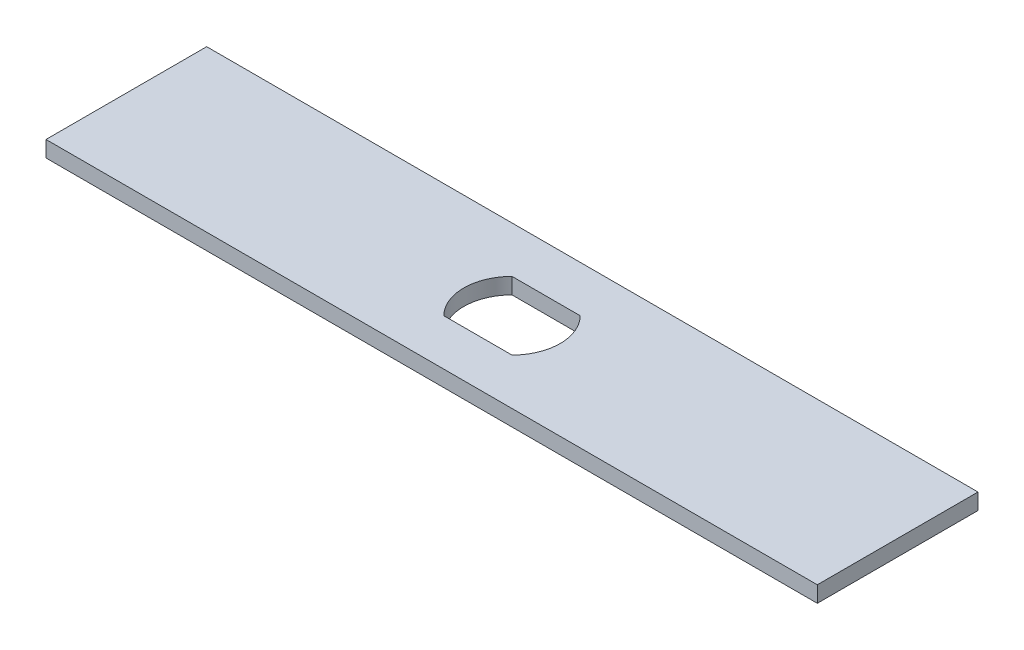
ISO-10303-21;
HEADER;
FILE_DESCRIPTION(('STEP AP214'),'2;1');
FILE_NAME('part.step','',(''),(''),'','','');
FILE_SCHEMA(('AUTOMOTIVE_DESIGN { 1 0 10303 214 1 1 1 1 }'));
ENDSEC;
DATA;
#1=APPLICATION_CONTEXT('core data for automotive mechanical design processes');
#2=APPLICATION_PROTOCOL_DEFINITION('international standard','automotive_design',2000,#1);
#3=PRODUCT_CONTEXT('',#1,'mechanical');
#4=PRODUCT('Part','Part','',(#3));
#5=PRODUCT_RELATED_PRODUCT_CATEGORY('part','',(#4));
#6=PRODUCT_DEFINITION_FORMATION('','',#4);
#7=PRODUCT_DEFINITION_CONTEXT('part definition',#1,'design');
#8=PRODUCT_DEFINITION('design','',#6,#7);
#9=PRODUCT_DEFINITION_SHAPE('','',#8);
#10=(LENGTH_UNIT() NAMED_UNIT(*) SI_UNIT(.MILLI.,.METRE.));
#11=(NAMED_UNIT(*) PLANE_ANGLE_UNIT() SI_UNIT($,.RADIAN.));
#12=(NAMED_UNIT(*) SI_UNIT($,.STERADIAN.) SOLID_ANGLE_UNIT());
#13=UNCERTAINTY_MEASURE_WITH_UNIT(LENGTH_MEASURE(1.E-05),#10,'distance_accuracy_value','');
#14=(GEOMETRIC_REPRESENTATION_CONTEXT(3) GLOBAL_UNCERTAINTY_ASSIGNED_CONTEXT((#13)) GLOBAL_UNIT_ASSIGNED_CONTEXT((#10,
#11,#12)) REPRESENTATION_CONTEXT('',''));
#15=CARTESIAN_POINT('',(0.,0.,0.));
#16=DIRECTION('',(0.,0.,1.));
#17=DIRECTION('',(1.,0.,0.));
#18=AXIS2_PLACEMENT_3D('',#15,#16,#17);
#19=CARTESIAN_POINT('',(0.,6.35,0.));
#20=DIRECTION('',(0.,0.,-1.));
#21=DIRECTION('',(-1.,0.,0.));
#22=AXIS2_PLACEMENT_3D('',#19,#20,#21);
#23=PLANE('',#22);
#24=DIRECTION('',(1.,0.,0.));
#25=VECTOR('',#24,1.);
#26=CARTESIAN_POINT('',(0.,0.,0.));
#27=LINE('',#26,#25);
#28=CARTESIAN_POINT('',(0.,0.,0.));
#29=VERTEX_POINT('',#28);
#30=CARTESIAN_POINT('',(304.8,0.,0.));
#31=VERTEX_POINT('',#30);
#32=EDGE_CURVE('E159',#29,#31,#27,.T.);
#33=ORIENTED_EDGE('',*,*,#32,.T.);
#34=DIRECTION('',(0.,-1.,0.));
#35=VECTOR('',#34,1.);
#36=CARTESIAN_POINT('',(304.8,6.35,0.));
#37=LINE('',#36,#35);
#38=CARTESIAN_POINT('',(304.8,6.35,0.));
#39=VERTEX_POINT('',#38);
#40=EDGE_CURVE('E11',#39,#31,#37,.T.);
#41=ORIENTED_EDGE('',*,*,#40,.F.);
#42=DIRECTION('',(1.,0.,0.));
#43=VECTOR('',#42,1.);
#44=CARTESIAN_POINT('',(0.,6.35,0.));
#45=LINE('',#44,#43);
#46=CARTESIAN_POINT('',(0.,6.35,0.));
#47=VERTEX_POINT('',#46);
#48=EDGE_CURVE('E125',#47,#39,#45,.T.);
#49=ORIENTED_EDGE('',*,*,#48,.F.);
#50=DIRECTION('',(0.,-1.,0.));
#51=VECTOR('',#50,1.);
#52=CARTESIAN_POINT('',(0.,6.35,0.));
#53=LINE('',#52,#51);
#54=EDGE_CURVE('E65',#47,#29,#53,.T.);
#55=ORIENTED_EDGE('',*,*,#54,.T.);
#56=EDGE_LOOP('',(#33,#41,#49,#55));
#57=FACE_BOUND('',#56,.T.);
#58=ADVANCED_FACE('F45',(#57),#23,.F.);
#59=CARTESIAN_POINT('',(304.8,6.35,0.));
#60=DIRECTION('',(-1.,0.,0.));
#61=DIRECTION('',(0.,0.,1.));
#62=AXIS2_PLACEMENT_3D('',#59,#60,#61);
#63=PLANE('',#62);
#64=DIRECTION('',(0.,0.,-1.));
#65=VECTOR('',#64,1.);
#66=CARTESIAN_POINT('',(304.8,0.,0.));
#67=LINE('',#66,#65);
#68=CARTESIAN_POINT('',(304.8,0.,-63.5));
#69=VERTEX_POINT('',#68);
#70=EDGE_CURVE('E132',#31,#69,#67,.T.);
#71=ORIENTED_EDGE('',*,*,#70,.T.);
#72=DIRECTION('',(0.,-1.,0.));
#73=VECTOR('',#72,1.);
#74=CARTESIAN_POINT('',(304.8,6.35,-63.5));
#75=LINE('',#74,#73);
#76=CARTESIAN_POINT('',(304.8,6.35,-63.5));
#77=VERTEX_POINT('',#76);
#78=EDGE_CURVE('E56',#77,#69,#75,.T.);
#79=ORIENTED_EDGE('',*,*,#78,.F.);
#80=DIRECTION('',(0.,0.,-1.));
#81=VECTOR('',#80,1.);
#82=CARTESIAN_POINT('',(304.8,6.35,0.));
#83=LINE('',#82,#81);
#84=EDGE_CURVE('E119',#39,#77,#83,.T.);
#85=ORIENTED_EDGE('',*,*,#84,.F.);
#86=ORIENTED_EDGE('',*,*,#40,.T.);
#87=EDGE_LOOP('',(#71,#79,#85,#86));
#88=FACE_BOUND('',#87,.T.);
#89=ADVANCED_FACE('F131',(#88),#63,.F.);
#90=CARTESIAN_POINT('',(0.,6.35,-63.5));
#91=DIRECTION('',(0.,0.,-1.));
#92=DIRECTION('',(-1.,0.,0.));
#93=AXIS2_PLACEMENT_3D('',#90,#91,#92);
#94=PLANE('',#93);
#95=DIRECTION('',(1.,0.,0.));
#96=VECTOR('',#95,1.);
#97=CARTESIAN_POINT('',(0.,0.,-63.5));
#98=LINE('',#97,#96);
#99=CARTESIAN_POINT('',(0.,0.,-63.5));
#100=VERTEX_POINT('',#99);
#101=EDGE_CURVE('E164',#100,#69,#98,.T.);
#102=ORIENTED_EDGE('',*,*,#101,.F.);
#103=DIRECTION('',(0.,-1.,0.));
#104=VECTOR('',#103,1.);
#105=CARTESIAN_POINT('',(0.,6.35,-63.5));
#106=LINE('',#105,#104);
#107=CARTESIAN_POINT('',(0.,6.35,-63.5));
#108=VERTEX_POINT('',#107);
#109=EDGE_CURVE('E91',#108,#100,#106,.T.);
#110=ORIENTED_EDGE('',*,*,#109,.F.);
#111=DIRECTION('',(1.,0.,0.));
#112=VECTOR('',#111,1.);
#113=CARTESIAN_POINT('',(0.,6.35,-63.5));
#114=LINE('',#113,#112);
#115=EDGE_CURVE('E124',#108,#77,#114,.T.);
#116=ORIENTED_EDGE('',*,*,#115,.T.);
#117=ORIENTED_EDGE('',*,*,#78,.T.);
#118=EDGE_LOOP('',(#102,#110,#116,#117));
#119=FACE_BOUND('',#118,.T.);
#120=ADVANCED_FACE('F137',(#119),#94,.T.);
#121=CARTESIAN_POINT('',(152.4,6.35,-31.75));
#122=DIRECTION('',(0.,-1.,0.));
#123=DIRECTION('',(0.,0.,-1.));
#124=AXIS2_PLACEMENT_3D('',#121,#122,#123);
#125=CYLINDRICAL_SURFACE('',#124,19.05);
#126=CARTESIAN_POINT('',(152.4,0.,-31.75));
#127=DIRECTION('',(0.,1.,0.));
#128=DIRECTION('',(0.,0.,1.));
#129=AXIS2_PLACEMENT_3D('',#126,#127,#128);
#130=CIRCLE('',#129,19.05);
#131=CARTESIAN_POINT('',(165.870384181604,0.,-18.2796158183964));
#132=VERTEX_POINT('',#131);
#133=CARTESIAN_POINT('',(165.870384181604,0.,-45.2203841816036));
#134=VERTEX_POINT('',#133);
#135=EDGE_CURVE('E146',#132,#134,#130,.T.);
#136=ORIENTED_EDGE('',*,*,#135,.F.);
#137=DIRECTION('',(0.,-1.,0.));
#138=VECTOR('',#137,1.);
#139=CARTESIAN_POINT('',(165.870384181604,6.35,-18.2796158183964));
#140=LINE('',#139,#138);
#141=CARTESIAN_POINT('',(165.870384181604,6.35,-18.2796158183964));
#142=VERTEX_POINT('',#141);
#143=EDGE_CURVE('E49',#142,#132,#140,.T.);
#144=ORIENTED_EDGE('',*,*,#143,.F.);
#145=CARTESIAN_POINT('',(152.4,6.35,-31.75));
#146=DIRECTION('',(0.,1.,0.));
#147=DIRECTION('',(0.,0.,1.));
#148=AXIS2_PLACEMENT_3D('',#145,#146,#147);
#149=CIRCLE('',#148,19.05);
#150=CARTESIAN_POINT('',(165.870384181604,6.35,-45.2203841816036));
#151=VERTEX_POINT('',#150);
#152=EDGE_CURVE('E171',#142,#151,#149,.T.);
#153=ORIENTED_EDGE('',*,*,#152,.T.);
#154=DIRECTION('',(0.,-1.,0.));
#155=VECTOR('',#154,1.);
#156=CARTESIAN_POINT('',(165.870384181604,6.35,-45.2203841816036));
#157=LINE('',#156,#155);
#158=EDGE_CURVE('E142',#151,#134,#157,.T.);
#159=ORIENTED_EDGE('',*,*,#158,.T.);
#160=EDGE_LOOP('',(#136,#144,#153,#159));
#161=FACE_BOUND('',#160,.T.);
#162=ADVANCED_FACE('F196',(#161),#125,.F.);
#163=CARTESIAN_POINT('',(0.,6.35,-18.2796158183964));
#164=DIRECTION('',(0.,0.,1.));
#165=DIRECTION('',(1.,0.,0.));
#166=AXIS2_PLACEMENT_3D('',#163,#164,#165);
#167=PLANE('',#166);
#168=DIRECTION('',(-1.,0.,0.));
#169=VECTOR('',#168,1.);
#170=CARTESIAN_POINT('',(0.,0.,-18.2796158183964));
#171=LINE('',#170,#169);
#172=CARTESIAN_POINT('',(138.929615818396,0.,-18.2796158183964));
#173=VERTEX_POINT('',#172);
#174=EDGE_CURVE('E150',#132,#173,#171,.T.);
#175=ORIENTED_EDGE('',*,*,#174,.T.);
#176=DIRECTION('',(0.,-1.,0.));
#177=VECTOR('',#176,1.);
#178=CARTESIAN_POINT('',(138.929615818396,6.35,-18.2796158183964));
#179=LINE('',#178,#177);
#180=CARTESIAN_POINT('',(138.929615818396,6.35,-18.2796158183964));
#181=VERTEX_POINT('',#180);
#182=EDGE_CURVE('E180',#181,#173,#179,.T.);
#183=ORIENTED_EDGE('',*,*,#182,.F.);
#184=DIRECTION('',(-1.,0.,0.));
#185=VECTOR('',#184,1.);
#186=CARTESIAN_POINT('',(0.,6.35,-18.2796158183964));
#187=LINE('',#186,#185);
#188=EDGE_CURVE('E190',#142,#181,#187,.T.);
#189=ORIENTED_EDGE('',*,*,#188,.F.);
#190=ORIENTED_EDGE('',*,*,#143,.T.);
#191=EDGE_LOOP('',(#175,#183,#189,#190));
#192=FACE_BOUND('',#191,.T.);
#193=ADVANCED_FACE('F47',(#192),#167,.F.);
#194=CARTESIAN_POINT('',(138.929615818396,0.,-45.2203841816036));
#195=VERTEX_POINT('',#194);
#196=EDGE_CURVE('E151',#195,#173,#130,.T.);
#197=ORIENTED_EDGE('',*,*,#196,.F.);
#198=DIRECTION('',(0.,-1.,0.));
#199=VECTOR('',#198,1.);
#200=CARTESIAN_POINT('',(138.929615818396,6.35,-45.2203841816036));
#201=LINE('',#200,#199);
#202=CARTESIAN_POINT('',(138.929615818396,6.35,-45.2203841816036));
#203=VERTEX_POINT('',#202);
#204=EDGE_CURVE('E178',#203,#195,#201,.T.);
#205=ORIENTED_EDGE('',*,*,#204,.F.);
#206=EDGE_CURVE('E208',#203,#181,#149,.T.);
#207=ORIENTED_EDGE('',*,*,#206,.T.);
#208=ORIENTED_EDGE('',*,*,#182,.T.);
#209=EDGE_LOOP('',(#197,#205,#207,#208));
#210=FACE_BOUND('',#209,.T.);
#211=ADVANCED_FACE('F203',(#210),#125,.F.);
#212=CARTESIAN_POINT('',(0.,6.35,-45.2203841816036));
#213=DIRECTION('',(0.,0.,1.));
#214=DIRECTION('',(1.,0.,0.));
#215=AXIS2_PLACEMENT_3D('',#212,#213,#214);
#216=PLANE('',#215);
#217=DIRECTION('',(-1.,0.,0.));
#218=VECTOR('',#217,1.);
#219=CARTESIAN_POINT('',(0.,0.,-45.2203841816036));
#220=LINE('',#219,#218);
#221=EDGE_CURVE('E155',#134,#195,#220,.T.);
#222=ORIENTED_EDGE('',*,*,#221,.F.);
#223=ORIENTED_EDGE('',*,*,#158,.F.);
#224=DIRECTION('',(-1.,0.,0.));
#225=VECTOR('',#224,1.);
#226=CARTESIAN_POINT('',(0.,6.35,-45.2203841816036));
#227=LINE('',#226,#225);
#228=EDGE_CURVE('E201',#151,#203,#227,.T.);
#229=ORIENTED_EDGE('',*,*,#228,.T.);
#230=ORIENTED_EDGE('',*,*,#204,.T.);
#231=EDGE_LOOP('',(#222,#223,#229,#230));
#232=FACE_BOUND('',#231,.T.);
#233=ADVANCED_FACE('F200',(#232),#216,.T.);
#234=CARTESIAN_POINT('',(0.,6.35,0.));
#235=DIRECTION('',(-1.,0.,0.));
#236=DIRECTION('',(0.,0.,1.));
#237=AXIS2_PLACEMENT_3D('',#234,#235,#236);
#238=PLANE('',#237);
#239=DIRECTION('',(0.,0.,-1.));
#240=VECTOR('',#239,1.);
#241=CARTESIAN_POINT('',(0.,0.,0.));
#242=LINE('',#241,#240);
#243=EDGE_CURVE('E167',#29,#100,#242,.T.);
#244=ORIENTED_EDGE('',*,*,#243,.F.);
#245=ORIENTED_EDGE('',*,*,#54,.F.);
#246=DIRECTION('',(0.,0.,-1.));
#247=VECTOR('',#246,1.);
#248=CARTESIAN_POINT('',(0.,6.35,0.));
#249=LINE('',#248,#247);
#250=EDGE_CURVE('E139',#47,#108,#249,.T.);
#251=ORIENTED_EDGE('',*,*,#250,.T.);
#252=ORIENTED_EDGE('',*,*,#109,.T.);
#253=EDGE_LOOP('',(#244,#245,#251,#252));
#254=FACE_BOUND('',#253,.T.);
#255=ADVANCED_FACE('F216',(#254),#238,.T.);
#256=CARTESIAN_POINT('',(0.,6.35,0.));
#257=DIRECTION('',(0.,1.,0.));
#258=DIRECTION('',(0.,0.,1.));
#259=AXIS2_PLACEMENT_3D('',#256,#257,#258);
#260=PLANE('',#259);
#261=ORIENTED_EDGE('',*,*,#152,.F.);
#262=ORIENTED_EDGE('',*,*,#188,.T.);
#263=ORIENTED_EDGE('',*,*,#206,.F.);
#264=ORIENTED_EDGE('',*,*,#228,.F.);
#265=EDGE_LOOP('',(#261,#262,#263,#264));
#266=FACE_BOUND('',#265,.T.);
#267=ORIENTED_EDGE('',*,*,#48,.T.);
#268=ORIENTED_EDGE('',*,*,#84,.T.);
#269=ORIENTED_EDGE('',*,*,#115,.F.);
#270=ORIENTED_EDGE('',*,*,#250,.F.);
#271=EDGE_LOOP('',(#267,#268,#269,#270));
#272=FACE_BOUND('',#271,.T.);
#273=ADVANCED_FACE('F121',(#266,#272),#260,.T.);
#274=CARTESIAN_POINT('',(0.,0.,0.));
#275=DIRECTION('',(0.,1.,0.));
#276=DIRECTION('',(0.,0.,1.));
#277=AXIS2_PLACEMENT_3D('',#274,#275,#276);
#278=PLANE('',#277);
#279=ORIENTED_EDGE('',*,*,#135,.T.);
#280=ORIENTED_EDGE('',*,*,#221,.T.);
#281=ORIENTED_EDGE('',*,*,#196,.T.);
#282=ORIENTED_EDGE('',*,*,#174,.F.);
#283=EDGE_LOOP('',(#279,#280,#281,#282));
#284=FACE_BOUND('',#283,.T.);
#285=ORIENTED_EDGE('',*,*,#32,.F.);
#286=ORIENTED_EDGE('',*,*,#243,.T.);
#287=ORIENTED_EDGE('',*,*,#101,.T.);
#288=ORIENTED_EDGE('',*,*,#70,.F.);
#289=EDGE_LOOP('',(#285,#286,#287,#288));
#290=FACE_BOUND('',#289,.T.);
#291=ADVANCED_FACE('F193',(#284,#290),#278,.F.);
#292=CLOSED_SHELL('',(#58,#89,#120,#162,#193,#211,#233,#255,#273,#291));
#293=MANIFOLD_SOLID_BREP('B2',#292);
#294=ADVANCED_BREP_SHAPE_REPRESENTATION('',(#18,#293),#14);
#295=SHAPE_DEFINITION_REPRESENTATION(#9,#294);
ENDSEC;
END-ISO-10303-21;
